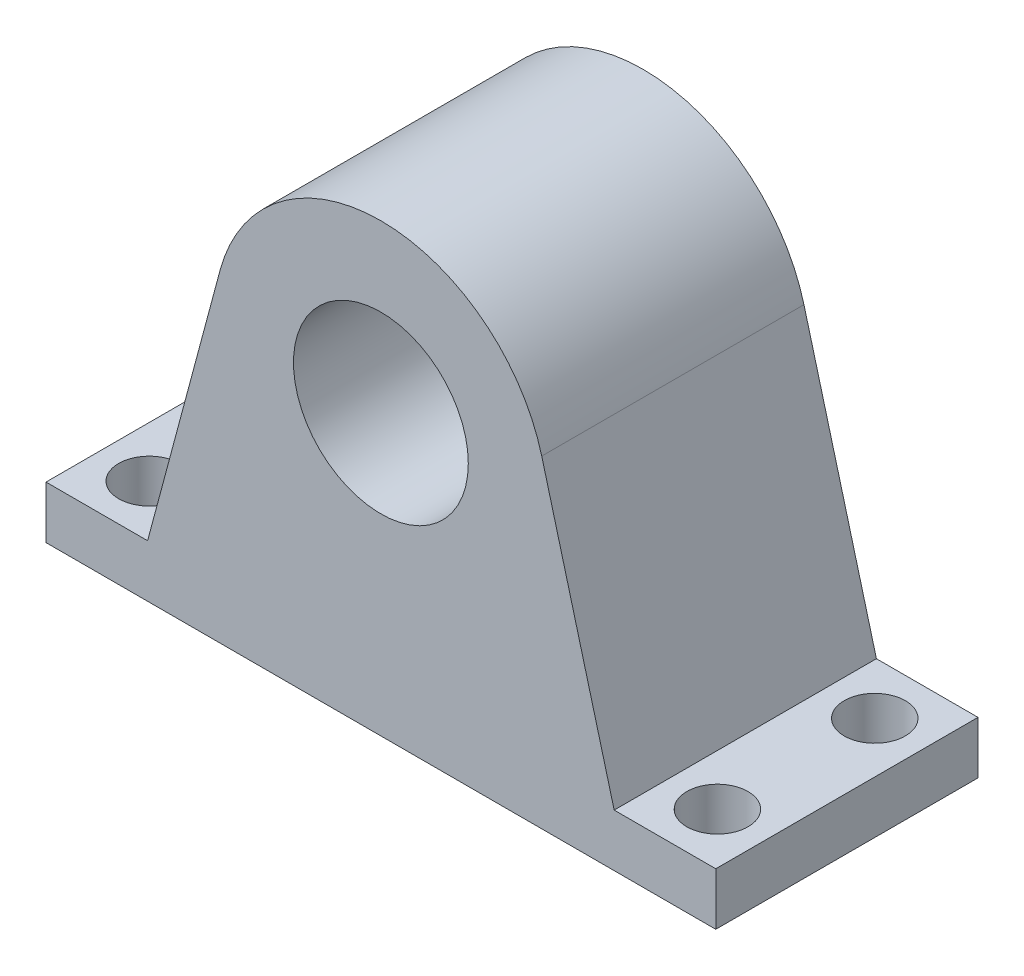
ISO-10303-21;
HEADER;
FILE_DESCRIPTION(('STEP AP214'),'2;1');
FILE_NAME('part.step','',(''),(''),'','','');
FILE_SCHEMA(('AUTOMOTIVE_DESIGN { 1 0 10303 214 1 1 1 1 }'));
ENDSEC;
DATA;
#1=APPLICATION_CONTEXT('core data for automotive mechanical design processes');
#2=APPLICATION_PROTOCOL_DEFINITION('international standard','automotive_design',2000,#1);
#3=PRODUCT_CONTEXT('',#1,'mechanical');
#4=PRODUCT('Part','Part','',(#3));
#5=PRODUCT_RELATED_PRODUCT_CATEGORY('part','',(#4));
#6=PRODUCT_DEFINITION_FORMATION('','',#4);
#7=PRODUCT_DEFINITION_CONTEXT('part definition',#1,'design');
#8=PRODUCT_DEFINITION('design','',#6,#7);
#9=PRODUCT_DEFINITION_SHAPE('','',#8);
#10=(LENGTH_UNIT() NAMED_UNIT(*) SI_UNIT(.MILLI.,.METRE.));
#11=(NAMED_UNIT(*) PLANE_ANGLE_UNIT() SI_UNIT($,.RADIAN.));
#12=(NAMED_UNIT(*) SI_UNIT($,.STERADIAN.) SOLID_ANGLE_UNIT());
#13=UNCERTAINTY_MEASURE_WITH_UNIT(LENGTH_MEASURE(1.E-05),#10,'distance_accuracy_value','');
#14=(GEOMETRIC_REPRESENTATION_CONTEXT(3) GLOBAL_UNCERTAINTY_ASSIGNED_CONTEXT((#13)) GLOBAL_UNIT_ASSIGNED_CONTEXT((#10,
#11,#12)) REPRESENTATION_CONTEXT('',''));
#15=CARTESIAN_POINT('',(0.,0.,0.));
#16=DIRECTION('',(0.,0.,1.));
#17=DIRECTION('',(1.,0.,0.));
#18=AXIS2_PLACEMENT_3D('',#15,#16,#17);
#19=CARTESIAN_POINT('',(18.4008869908067,36.9305028092031,30.));
#20=DIRECTION('',(0.965925826289067,0.258819045102525,0.));
#21=DIRECTION('',(-0.258819045102525,0.965925826289067,0.));
#22=AXIS2_PLACEMENT_3D('',#19,#20,#21);
#23=PLANE('',#22);
#24=DIRECTION('',(0.258819045102525,-0.965925826289067,0.));
#25=VECTOR('',#24,1.);
#26=CARTESIAN_POINT('',(18.4008869908067,36.9305028092031,0.));
#27=LINE('',#26,#25);
#28=CARTESIAN_POINT('',(18.4008869908067,36.9305028092031,0.));
#29=VERTEX_POINT('',#28);
#30=CARTESIAN_POINT('',(26.6886902400214,5.99999999999999,0.));
#31=VERTEX_POINT('',#30);
#32=EDGE_CURVE('E149',#29,#31,#27,.T.);
#33=ORIENTED_EDGE('',*,*,#32,.F.);
#34=DIRECTION('',(0.,0.,-1.));
#35=VECTOR('',#34,1.);
#36=CARTESIAN_POINT('',(18.4008869908067,36.9305028092031,30.));
#37=LINE('',#36,#35);
#38=CARTESIAN_POINT('',(18.4008869908067,36.9305028092031,30.));
#39=VERTEX_POINT('',#38);
#40=EDGE_CURVE('E11',#39,#29,#37,.T.);
#41=ORIENTED_EDGE('',*,*,#40,.F.);
#42=DIRECTION('',(0.258819045102525,-0.965925826289067,0.));
#43=VECTOR('',#42,1.);
#44=CARTESIAN_POINT('',(18.4008869908067,36.9305028092031,30.));
#45=LINE('',#44,#43);
#46=CARTESIAN_POINT('',(26.6886902400214,5.99999999999999,30.));
#47=VERTEX_POINT('',#46);
#48=EDGE_CURVE('E177',#39,#47,#45,.T.);
#49=ORIENTED_EDGE('',*,*,#48,.T.);
#50=DIRECTION('',(0.,0.,-1.));
#51=VECTOR('',#50,1.);
#52=CARTESIAN_POINT('',(26.6886902400214,5.99999999999999,30.));
#53=LINE('',#52,#51);
#54=EDGE_CURVE('E104',#47,#31,#53,.T.);
#55=ORIENTED_EDGE('',*,*,#54,.T.);
#56=EDGE_LOOP('',(#33,#41,#49,#55));
#57=FACE_BOUND('',#56,.T.);
#58=ADVANCED_FACE('F47',(#57),#23,.T.);
#59=CARTESIAN_POINT('',(0.,32.,30.));
#60=DIRECTION('',(0.,0.,-1.));
#61=DIRECTION('',(-1.,0.,0.));
#62=AXIS2_PLACEMENT_3D('',#59,#60,#61);
#63=CYLINDRICAL_SURFACE('',#62,19.05);
#64=CARTESIAN_POINT('',(0.,32.,0.));
#65=DIRECTION('',(0.,0.,1.));
#66=DIRECTION('',(1.,0.,0.));
#67=AXIS2_PLACEMENT_3D('',#64,#65,#66);
#68=CIRCLE('',#67,19.05);
#69=CARTESIAN_POINT('',(-18.4008869908067,36.9305028092031,0.));
#70=VERTEX_POINT('',#69);
#71=EDGE_CURVE('E175',#29,#70,#68,.T.);
#72=ORIENTED_EDGE('',*,*,#71,.T.);
#73=DIRECTION('',(0.,0.,-1.));
#74=VECTOR('',#73,1.);
#75=CARTESIAN_POINT('',(-18.4008869908067,36.9305028092031,30.));
#76=LINE('',#75,#74);
#77=CARTESIAN_POINT('',(-18.4008869908067,36.9305028092031,30.));
#78=VERTEX_POINT('',#77);
#79=EDGE_CURVE('E57',#78,#70,#76,.T.);
#80=ORIENTED_EDGE('',*,*,#79,.F.);
#81=CARTESIAN_POINT('',(0.,32.,30.));
#82=DIRECTION('',(0.,0.,1.));
#83=DIRECTION('',(1.,0.,0.));
#84=AXIS2_PLACEMENT_3D('',#81,#82,#83);
#85=CIRCLE('',#84,19.05);
#86=EDGE_CURVE('E142',#39,#78,#85,.T.);
#87=ORIENTED_EDGE('',*,*,#86,.F.);
#88=ORIENTED_EDGE('',*,*,#40,.T.);
#89=EDGE_LOOP('',(#72,#80,#87,#88));
#90=FACE_BOUND('',#89,.T.);
#91=ADVANCED_FACE('F246',(#90),#63,.T.);
#92=CARTESIAN_POINT('',(-26.6886902400214,5.99999999999999,30.));
#93=DIRECTION('',(-0.965925826289067,0.258819045102525,0.));
#94=DIRECTION('',(-0.258819045102525,-0.965925826289067,0.));
#95=AXIS2_PLACEMENT_3D('',#92,#93,#94);
#96=PLANE('',#95);
#97=DIRECTION('',(0.258819045102525,0.965925826289067,0.));
#98=VECTOR('',#97,1.);
#99=CARTESIAN_POINT('',(-26.6886902400214,5.99999999999999,0.));
#100=LINE('',#99,#98);
#101=CARTESIAN_POINT('',(-26.6886902400214,5.99999999999999,0.));
#102=VERTEX_POINT('',#101);
#103=EDGE_CURVE('E124',#102,#70,#100,.T.);
#104=ORIENTED_EDGE('',*,*,#103,.F.);
#105=DIRECTION('',(0.,0.,-1.));
#106=VECTOR('',#105,1.);
#107=CARTESIAN_POINT('',(-26.6886902400214,5.99999999999999,30.));
#108=LINE('',#107,#106);
#109=CARTESIAN_POINT('',(-26.6886902400214,5.99999999999999,30.));
#110=VERTEX_POINT('',#109);
#111=EDGE_CURVE('E118',#110,#102,#108,.T.);
#112=ORIENTED_EDGE('',*,*,#111,.F.);
#113=DIRECTION('',(0.258819045102525,0.965925826289067,0.));
#114=VECTOR('',#113,1.);
#115=CARTESIAN_POINT('',(-26.6886902400214,5.99999999999999,30.));
#116=LINE('',#115,#114);
#117=EDGE_CURVE('E122',#110,#78,#116,.T.);
#118=ORIENTED_EDGE('',*,*,#117,.T.);
#119=ORIENTED_EDGE('',*,*,#79,.T.);
#120=EDGE_LOOP('',(#104,#112,#118,#119));
#121=FACE_BOUND('',#120,.T.);
#122=ADVANCED_FACE('F120',(#121),#96,.T.);
#123=CARTESIAN_POINT('',(-26.6886902400214,5.99999999999999,30.));
#124=DIRECTION('',(0.,-1.,0.));
#125=DIRECTION('',(1.,0.,0.));
#126=AXIS2_PLACEMENT_3D('',#123,#124,#125);
#127=PLANE('',#126);
#128=CARTESIAN_POINT('',(-32.5,6.,6.));
#129=DIRECTION('',(0.,1.,0.));
#130=DIRECTION('',(0.,0.,1.));
#131=AXIS2_PLACEMENT_3D('',#128,#129,#130);
#132=CIRCLE('',#131,3.49999999999999);
#133=CARTESIAN_POINT('',(-32.5,6.,9.49999999999999));
#134=VERTEX_POINT('',#133);
#135=EDGE_CURVE('E212',#134,#134,#132,.T.);
#136=ORIENTED_EDGE('',*,*,#135,.F.);
#137=EDGE_LOOP('',(#136));
#138=FACE_BOUND('',#137,.T.);
#139=CARTESIAN_POINT('',(-32.5,6.,24.));
#140=DIRECTION('',(0.,1.,0.));
#141=DIRECTION('',(0.,0.,1.));
#142=AXIS2_PLACEMENT_3D('',#139,#140,#141);
#143=CIRCLE('',#142,3.49999999999999);
#144=CARTESIAN_POINT('',(-32.5,6.,27.5));
#145=VERTEX_POINT('',#144);
#146=EDGE_CURVE('E198',#145,#145,#143,.T.);
#147=ORIENTED_EDGE('',*,*,#146,.F.);
#148=EDGE_LOOP('',(#147));
#149=FACE_BOUND('',#148,.T.);
#150=DIRECTION('',(-1.,0.,0.));
#151=VECTOR('',#150,1.);
#152=CARTESIAN_POINT('',(-26.6886902400214,5.99999999999999,0.));
#153=LINE('',#152,#151);
#154=CARTESIAN_POINT('',(-38.3113097599786,6.,0.));
#155=VERTEX_POINT('',#154);
#156=EDGE_CURVE('E170',#102,#155,#153,.T.);
#157=ORIENTED_EDGE('',*,*,#156,.T.);
#158=DIRECTION('',(0.,0.,-1.));
#159=VECTOR('',#158,1.);
#160=CARTESIAN_POINT('',(-38.3113097599786,6.,30.));
#161=LINE('',#160,#159);
#162=CARTESIAN_POINT('',(-38.3113097599786,6.,30.));
#163=VERTEX_POINT('',#162);
#164=EDGE_CURVE('E128',#163,#155,#161,.T.);
#165=ORIENTED_EDGE('',*,*,#164,.F.);
#166=DIRECTION('',(-1.,0.,0.));
#167=VECTOR('',#166,1.);
#168=CARTESIAN_POINT('',(-26.6886902400214,5.99999999999999,30.));
#169=LINE('',#168,#167);
#170=EDGE_CURVE('E131',#110,#163,#169,.T.);
#171=ORIENTED_EDGE('',*,*,#170,.F.);
#172=ORIENTED_EDGE('',*,*,#111,.T.);
#173=EDGE_LOOP('',(#157,#165,#171,#172));
#174=FACE_BOUND('',#173,.T.);
#175=ADVANCED_FACE('F132',(#138,#149,#174),#127,.F.);
#176=CARTESIAN_POINT('',(-38.3113097599786,6.,30.));
#177=DIRECTION('',(1.,0.,0.));
#178=DIRECTION('',(0.,0.,-1.));
#179=AXIS2_PLACEMENT_3D('',#176,#177,#178);
#180=PLANE('',#179);
#181=DIRECTION('',(0.,-1.,0.));
#182=VECTOR('',#181,1.);
#183=CARTESIAN_POINT('',(-38.3113097599786,6.,0.));
#184=LINE('',#183,#182);
#185=CARTESIAN_POINT('',(-38.3113097599786,0.,0.));
#186=VERTEX_POINT('',#185);
#187=EDGE_CURVE('E166',#155,#186,#184,.T.);
#188=ORIENTED_EDGE('',*,*,#187,.T.);
#189=DIRECTION('',(0.,0.,-1.));
#190=VECTOR('',#189,1.);
#191=CARTESIAN_POINT('',(-38.3113097599786,0.,30.));
#192=LINE('',#191,#190);
#193=CARTESIAN_POINT('',(-38.3113097599786,0.,30.));
#194=VERTEX_POINT('',#193);
#195=EDGE_CURVE('E183',#194,#186,#192,.T.);
#196=ORIENTED_EDGE('',*,*,#195,.F.);
#197=DIRECTION('',(0.,-1.,0.));
#198=VECTOR('',#197,1.);
#199=CARTESIAN_POINT('',(-38.3113097599786,6.,30.));
#200=LINE('',#199,#198);
#201=EDGE_CURVE('E138',#163,#194,#200,.T.);
#202=ORIENTED_EDGE('',*,*,#201,.F.);
#203=ORIENTED_EDGE('',*,*,#164,.T.);
#204=EDGE_LOOP('',(#188,#196,#202,#203));
#205=FACE_BOUND('',#204,.T.);
#206=ADVANCED_FACE('F235',(#205),#180,.F.);
#207=CARTESIAN_POINT('',(0.,0.,30.));
#208=DIRECTION('',(0.,-1.,0.));
#209=DIRECTION('',(1.,0.,0.));
#210=AXIS2_PLACEMENT_3D('',#207,#208,#209);
#211=PLANE('',#210);
#212=CARTESIAN_POINT('',(32.5,0.,6.));
#213=DIRECTION('',(0.,-1.,0.));
#214=DIRECTION('',(1.,0.,0.));
#215=AXIS2_PLACEMENT_3D('',#212,#213,#214);
#216=CIRCLE('',#215,3.49999999999999);
#217=CARTESIAN_POINT('',(36.,0.,6.));
#218=VERTEX_POINT('',#217);
#219=EDGE_CURVE('E282',#218,#218,#216,.T.);
#220=ORIENTED_EDGE('',*,*,#219,.F.);
#221=EDGE_LOOP('',(#220));
#222=FACE_BOUND('',#221,.T.);
#223=CARTESIAN_POINT('',(32.5,0.,24.));
#224=DIRECTION('',(0.,-1.,0.));
#225=DIRECTION('',(1.,0.,0.));
#226=AXIS2_PLACEMENT_3D('',#223,#224,#225);
#227=CIRCLE('',#226,3.49999999999999);
#228=CARTESIAN_POINT('',(36.,0.,24.));
#229=VERTEX_POINT('',#228);
#230=EDGE_CURVE('E50',#229,#229,#227,.T.);
#231=ORIENTED_EDGE('',*,*,#230,.F.);
#232=EDGE_LOOP('',(#231));
#233=FACE_BOUND('',#232,.T.);
#234=CARTESIAN_POINT('',(-32.5,0.,6.));
#235=DIRECTION('',(0.,-1.,0.));
#236=DIRECTION('',(1.,0.,0.));
#237=AXIS2_PLACEMENT_3D('',#234,#235,#236);
#238=CIRCLE('',#237,3.49999999999999);
#239=CARTESIAN_POINT('',(-29.,0.,6.));
#240=VERTEX_POINT('',#239);
#241=EDGE_CURVE('E206',#240,#240,#238,.T.);
#242=ORIENTED_EDGE('',*,*,#241,.F.);
#243=EDGE_LOOP('',(#242));
#244=FACE_BOUND('',#243,.T.);
#245=CARTESIAN_POINT('',(-32.5,0.,24.));
#246=DIRECTION('',(0.,-1.,0.));
#247=DIRECTION('',(1.,0.,0.));
#248=AXIS2_PLACEMENT_3D('',#245,#246,#247);
#249=CIRCLE('',#248,3.49999999999999);
#250=CARTESIAN_POINT('',(-29.,0.,24.));
#251=VERTEX_POINT('',#250);
#252=EDGE_CURVE('E194',#251,#251,#249,.T.);
#253=ORIENTED_EDGE('',*,*,#252,.F.);
#254=EDGE_LOOP('',(#253));
#255=FACE_BOUND('',#254,.T.);
#256=DIRECTION('',(-1.,0.,0.));
#257=VECTOR('',#256,1.);
#258=CARTESIAN_POINT('',(0.,0.,0.));
#259=LINE('',#258,#257);
#260=CARTESIAN_POINT('',(38.3113097599786,0.,0.));
#261=VERTEX_POINT('',#260);
#262=EDGE_CURVE('E162',#261,#186,#259,.T.);
#263=ORIENTED_EDGE('',*,*,#262,.F.);
#264=DIRECTION('',(0.,0.,-1.));
#265=VECTOR('',#264,1.);
#266=CARTESIAN_POINT('',(38.3113097599786,0.,30.));
#267=LINE('',#266,#265);
#268=CARTESIAN_POINT('',(38.3113097599786,0.,30.));
#269=VERTEX_POINT('',#268);
#270=EDGE_CURVE('E186',#269,#261,#267,.T.);
#271=ORIENTED_EDGE('',*,*,#270,.F.);
#272=DIRECTION('',(1.,0.,0.));
#273=VECTOR('',#272,1.);
#274=CARTESIAN_POINT('',(0.,0.,30.));
#275=LINE('',#274,#273);
#276=EDGE_CURVE('E228',#194,#269,#275,.T.);
#277=ORIENTED_EDGE('',*,*,#276,.F.);
#278=ORIENTED_EDGE('',*,*,#195,.T.);
#279=EDGE_LOOP('',(#263,#271,#277,#278));
#280=FACE_BOUND('',#279,.T.);
#281=ADVANCED_FACE('F238',(#222,#233,#244,#255,#280),#211,.T.);
#282=CARTESIAN_POINT('',(38.3113097599786,6.,30.));
#283=DIRECTION('',(1.,0.,0.));
#284=DIRECTION('',(0.,0.,-1.));
#285=AXIS2_PLACEMENT_3D('',#282,#283,#284);
#286=PLANE('',#285);
#287=DIRECTION('',(0.,-1.,0.));
#288=VECTOR('',#287,1.);
#289=CARTESIAN_POINT('',(38.3113097599786,6.,0.));
#290=LINE('',#289,#288);
#291=CARTESIAN_POINT('',(38.3113097599786,6.,0.));
#292=VERTEX_POINT('',#291);
#293=EDGE_CURVE('E158',#292,#261,#290,.T.);
#294=ORIENTED_EDGE('',*,*,#293,.F.);
#295=DIRECTION('',(0.,0.,-1.));
#296=VECTOR('',#295,1.);
#297=CARTESIAN_POINT('',(38.3113097599786,6.,30.));
#298=LINE('',#297,#296);
#299=CARTESIAN_POINT('',(38.3113097599786,6.,30.));
#300=VERTEX_POINT('',#299);
#301=EDGE_CURVE('E190',#300,#292,#298,.T.);
#302=ORIENTED_EDGE('',*,*,#301,.F.);
#303=DIRECTION('',(0.,-1.,0.));
#304=VECTOR('',#303,1.);
#305=CARTESIAN_POINT('',(38.3113097599786,6.,30.));
#306=LINE('',#305,#304);
#307=EDGE_CURVE('E224',#300,#269,#306,.T.);
#308=ORIENTED_EDGE('',*,*,#307,.T.);
#309=ORIENTED_EDGE('',*,*,#270,.T.);
#310=EDGE_LOOP('',(#294,#302,#308,#309));
#311=FACE_BOUND('',#310,.T.);
#312=ADVANCED_FACE('F241',(#311),#286,.T.);
#313=CARTESIAN_POINT('',(26.6886902400214,5.99999999999999,30.));
#314=DIRECTION('',(0.,1.,0.));
#315=DIRECTION('',(-1.,0.,0.));
#316=AXIS2_PLACEMENT_3D('',#313,#314,#315);
#317=PLANE('',#316);
#318=CARTESIAN_POINT('',(32.5,6.,6.));
#319=DIRECTION('',(0.,1.,0.));
#320=DIRECTION('',(0.,0.,1.));
#321=AXIS2_PLACEMENT_3D('',#318,#319,#320);
#322=CIRCLE('',#321,3.49999999999999);
#323=CARTESIAN_POINT('',(32.5,6.,9.49999999999999));
#324=VERTEX_POINT('',#323);
#325=EDGE_CURVE('E276',#324,#324,#322,.T.);
#326=ORIENTED_EDGE('',*,*,#325,.F.);
#327=EDGE_LOOP('',(#326));
#328=FACE_BOUND('',#327,.T.);
#329=CARTESIAN_POINT('',(32.5,6.,24.));
#330=DIRECTION('',(0.,1.,0.));
#331=DIRECTION('',(0.,0.,1.));
#332=AXIS2_PLACEMENT_3D('',#329,#330,#331);
#333=CIRCLE('',#332,3.49999999999999);
#334=CARTESIAN_POINT('',(32.5,6.,27.5));
#335=VERTEX_POINT('',#334);
#336=EDGE_CURVE('E279',#335,#335,#333,.T.);
#337=ORIENTED_EDGE('',*,*,#336,.F.);
#338=EDGE_LOOP('',(#337));
#339=FACE_BOUND('',#338,.T.);
#340=DIRECTION('',(1.,0.,0.));
#341=VECTOR('',#340,1.);
#342=CARTESIAN_POINT('',(26.6886902400214,5.99999999999999,0.));
#343=LINE('',#342,#341);
#344=EDGE_CURVE('E153',#31,#292,#343,.T.);
#345=ORIENTED_EDGE('',*,*,#344,.F.);
#346=ORIENTED_EDGE('',*,*,#54,.F.);
#347=DIRECTION('',(1.,0.,0.));
#348=VECTOR('',#347,1.);
#349=CARTESIAN_POINT('',(26.6886902400214,5.99999999999999,30.));
#350=LINE('',#349,#348);
#351=EDGE_CURVE('E221',#47,#300,#350,.T.);
#352=ORIENTED_EDGE('',*,*,#351,.T.);
#353=ORIENTED_EDGE('',*,*,#301,.T.);
#354=EDGE_LOOP('',(#345,#346,#352,#353));
#355=FACE_BOUND('',#354,.T.);
#356=ADVANCED_FACE('F242',(#328,#339,#355),#317,.T.);
#357=CARTESIAN_POINT('',(0.,32.,30.));
#358=DIRECTION('',(0.,0.,1.));
#359=DIRECTION('',(1.,0.,0.));
#360=AXIS2_PLACEMENT_3D('',#357,#358,#359);
#361=PLANE('',#360);
#362=CARTESIAN_POINT('',(0.,32.,30.));
#363=DIRECTION('',(0.,0.,1.));
#364=DIRECTION('',(1.,0.,0.));
#365=AXIS2_PLACEMENT_3D('',#362,#363,#364);
#366=CIRCLE('',#365,9.99999999999999);
#367=CARTESIAN_POINT('',(9.99999999999999,32.,30.));
#368=VERTEX_POINT('',#367);
#369=EDGE_CURVE('E197',#368,#368,#366,.T.);
#370=ORIENTED_EDGE('',*,*,#369,.F.);
#371=EDGE_LOOP('',(#370));
#372=FACE_BOUND('',#371,.T.);
#373=ORIENTED_EDGE('',*,*,#48,.F.);
#374=ORIENTED_EDGE('',*,*,#86,.T.);
#375=ORIENTED_EDGE('',*,*,#117,.F.);
#376=ORIENTED_EDGE('',*,*,#170,.T.);
#377=ORIENTED_EDGE('',*,*,#201,.T.);
#378=ORIENTED_EDGE('',*,*,#276,.T.);
#379=ORIENTED_EDGE('',*,*,#307,.F.);
#380=ORIENTED_EDGE('',*,*,#351,.F.);
#381=EDGE_LOOP('',(#373,#374,#375,#376,#377,#378,#379,#380));
#382=FACE_BOUND('',#381,.T.);
#383=ADVANCED_FACE('F141',(#372,#382),#361,.T.);
#384=CARTESIAN_POINT('',(0.,32.,0.));
#385=DIRECTION('',(0.,0.,1.));
#386=DIRECTION('',(1.,0.,0.));
#387=AXIS2_PLACEMENT_3D('',#384,#385,#386);
#388=PLANE('',#387);
#389=CARTESIAN_POINT('',(0.,32.,0.));
#390=DIRECTION('',(0.,0.,1.));
#391=DIRECTION('',(1.,0.,0.));
#392=AXIS2_PLACEMENT_3D('',#389,#390,#391);
#393=CIRCLE('',#392,9.99999999999999);
#394=CARTESIAN_POINT('',(9.99999999999998,32.,0.));
#395=VERTEX_POINT('',#394);
#396=EDGE_CURVE('E154',#395,#395,#393,.T.);
#397=ORIENTED_EDGE('',*,*,#396,.T.);
#398=EDGE_LOOP('',(#397));
#399=FACE_BOUND('',#398,.T.);
#400=ORIENTED_EDGE('',*,*,#32,.T.);
#401=ORIENTED_EDGE('',*,*,#344,.T.);
#402=ORIENTED_EDGE('',*,*,#293,.T.);
#403=ORIENTED_EDGE('',*,*,#262,.T.);
#404=ORIENTED_EDGE('',*,*,#187,.F.);
#405=ORIENTED_EDGE('',*,*,#156,.F.);
#406=ORIENTED_EDGE('',*,*,#103,.T.);
#407=ORIENTED_EDGE('',*,*,#71,.F.);
#408=EDGE_LOOP('',(#400,#401,#402,#403,#404,#405,#406,#407));
#409=FACE_BOUND('',#408,.T.);
#410=ADVANCED_FACE('F244',(#399,#409),#388,.F.);
#411=CARTESIAN_POINT('',(0.,32.,30.));
#412=DIRECTION('',(0.,0.,1.));
#413=DIRECTION('',(1.,0.,0.));
#414=AXIS2_PLACEMENT_3D('',#411,#412,#413);
#415=CYLINDRICAL_SURFACE('',#414,9.99999999999999);
#416=ORIENTED_EDGE('',*,*,#369,.T.);
#417=EDGE_LOOP('',(#416));
#418=FACE_BOUND('',#417,.T.);
#419=ORIENTED_EDGE('',*,*,#396,.F.);
#420=EDGE_LOOP('',(#419));
#421=FACE_BOUND('',#420,.T.);
#422=ADVANCED_FACE('F308',(#418,#421),#415,.F.);
#423=CARTESIAN_POINT('',(-32.5,6.,24.));
#424=DIRECTION('',(0.,1.,0.));
#425=DIRECTION('',(0.,0.,1.));
#426=AXIS2_PLACEMENT_3D('',#423,#424,#425);
#427=CYLINDRICAL_SURFACE('',#426,3.49999999999999);
#428=ORIENTED_EDGE('',*,*,#252,.T.);
#429=EDGE_LOOP('',(#428));
#430=FACE_BOUND('',#429,.T.);
#431=ORIENTED_EDGE('',*,*,#146,.T.);
#432=EDGE_LOOP('',(#431));
#433=FACE_BOUND('',#432,.T.);
#434=ADVANCED_FACE('F298',(#430,#433),#427,.F.);
#435=CARTESIAN_POINT('',(-32.5,6.,6.));
#436=DIRECTION('',(0.,1.,0.));
#437=DIRECTION('',(0.,0.,1.));
#438=AXIS2_PLACEMENT_3D('',#435,#436,#437);
#439=CYLINDRICAL_SURFACE('',#438,3.49999999999999);
#440=ORIENTED_EDGE('',*,*,#241,.T.);
#441=EDGE_LOOP('',(#440));
#442=FACE_BOUND('',#441,.T.);
#443=ORIENTED_EDGE('',*,*,#135,.T.);
#444=EDGE_LOOP('',(#443));
#445=FACE_BOUND('',#444,.T.);
#446=ADVANCED_FACE('F294',(#442,#445),#439,.F.);
#447=CARTESIAN_POINT('',(32.5,6.,24.));
#448=DIRECTION('',(0.,1.,0.));
#449=DIRECTION('',(0.,0.,1.));
#450=AXIS2_PLACEMENT_3D('',#447,#448,#449);
#451=CYLINDRICAL_SURFACE('',#450,3.49999999999999);
#452=ORIENTED_EDGE('',*,*,#230,.T.);
#453=EDGE_LOOP('',(#452));
#454=FACE_BOUND('',#453,.T.);
#455=ORIENTED_EDGE('',*,*,#336,.T.);
#456=EDGE_LOOP('',(#455));
#457=FACE_BOUND('',#456,.T.);
#458=ADVANCED_FACE('F297',(#454,#457),#451,.F.);
#459=CARTESIAN_POINT('',(32.5,6.,6.));
#460=DIRECTION('',(0.,1.,0.));
#461=DIRECTION('',(0.,0.,1.));
#462=AXIS2_PLACEMENT_3D('',#459,#460,#461);
#463=CYLINDRICAL_SURFACE('',#462,3.49999999999999);
#464=ORIENTED_EDGE('',*,*,#219,.T.);
#465=EDGE_LOOP('',(#464));
#466=FACE_BOUND('',#465,.T.);
#467=ORIENTED_EDGE('',*,*,#325,.T.);
#468=EDGE_LOOP('',(#467));
#469=FACE_BOUND('',#468,.T.);
#470=ADVANCED_FACE('F305',(#466,#469),#463,.F.);
#471=CLOSED_SHELL('',(#58,#91,#122,#175,#206,#281,#312,#356,#383,#410,#422,#434,#446,#458,#470));
#472=MANIFOLD_SOLID_BREP('B2',#471);
#473=ADVANCED_BREP_SHAPE_REPRESENTATION('',(#18,#472),#14);
#474=SHAPE_DEFINITION_REPRESENTATION(#9,#473);
ENDSEC;
END-ISO-10303-21;
